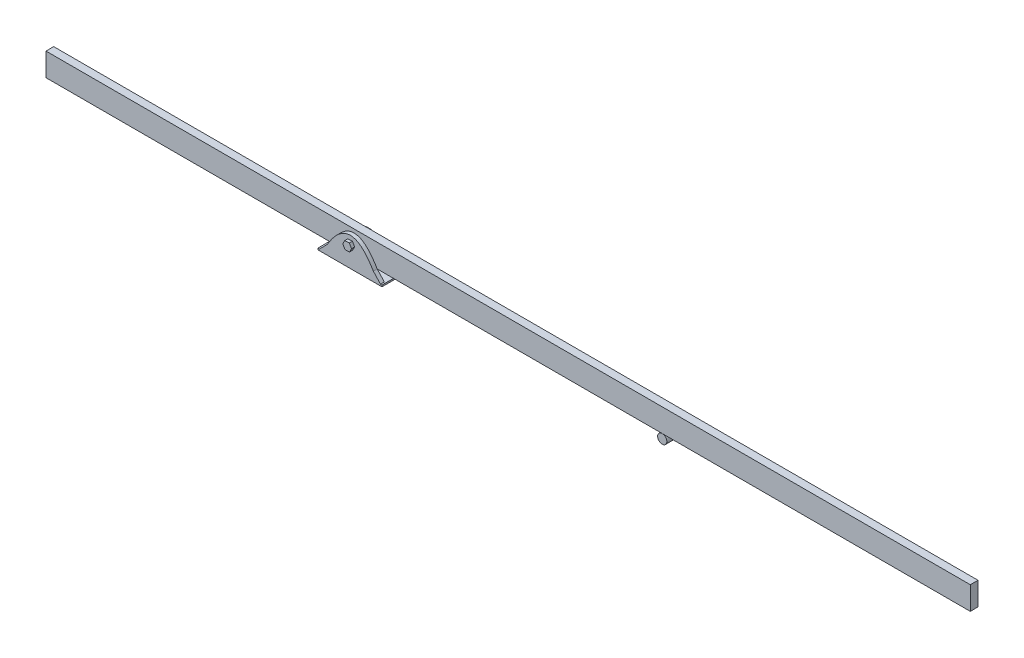
ISO-10303-21;
HEADER;
FILE_DESCRIPTION(('STEP AP214'),'2;1');
FILE_NAME('part.step','',(''),(''),'','','');
FILE_SCHEMA(('AUTOMOTIVE_DESIGN { 1 0 10303 214 1 1 1 1 }'));
ENDSEC;
DATA;
#1=APPLICATION_CONTEXT('core data for automotive mechanical design processes');
#2=APPLICATION_PROTOCOL_DEFINITION('international standard','automotive_design',2000,#1);
#3=PRODUCT_CONTEXT('',#1,'mechanical');
#4=PRODUCT('Part','Part','',(#3));
#5=PRODUCT_RELATED_PRODUCT_CATEGORY('part','',(#4));
#6=PRODUCT_DEFINITION_FORMATION('','',#4);
#7=PRODUCT_DEFINITION_CONTEXT('part definition',#1,'design');
#8=PRODUCT_DEFINITION('design','',#6,#7);
#9=PRODUCT_DEFINITION_SHAPE('','',#8);
#10=(LENGTH_UNIT() NAMED_UNIT(*) SI_UNIT(.MILLI.,.METRE.));
#11=(NAMED_UNIT(*) PLANE_ANGLE_UNIT() SI_UNIT($,.RADIAN.));
#12=(NAMED_UNIT(*) SI_UNIT($,.STERADIAN.) SOLID_ANGLE_UNIT());
#13=UNCERTAINTY_MEASURE_WITH_UNIT(LENGTH_MEASURE(1.E-05),#10,'distance_accuracy_value','');
#14=(GEOMETRIC_REPRESENTATION_CONTEXT(3) GLOBAL_UNCERTAINTY_ASSIGNED_CONTEXT((#13)) GLOBAL_UNIT_ASSIGNED_CONTEXT((#10,
#11,#12)) REPRESENTATION_CONTEXT('',''));
#15=CARTESIAN_POINT('',(0.,0.,0.));
#16=DIRECTION('',(0.,0.,1.));
#17=DIRECTION('',(1.,0.,0.));
#18=AXIS2_PLACEMENT_3D('',#15,#16,#17);
#19=CARTESIAN_POINT('',(0.,0.,-45.));
#20=DIRECTION('',(0.,0.,-1.));
#21=DIRECTION('',(-1.,0.,0.));
#22=AXIS2_PLACEMENT_3D('',#19,#20,#21);
#23=PLANE('',#22);
#24=DIRECTION('',(0.500000000000004,0.866025403784436,0.));
#25=VECTOR('',#24,1.);
#26=CARTESIAN_POINT('',(-1037.76365609631,-0.00780640067777938,-45.));
#27=LINE('',#26,#25);
#28=CARTESIAN_POINT('',(-1037.76365609631,-0.00780640067777938,-45.));
#29=VERTEX_POINT('',#28);
#30=CARTESIAN_POINT('',(-1018.88192562817,32.6963101049764,-45.));
#31=VERTEX_POINT('',#30);
#32=EDGE_CURVE('E147',#29,#31,#27,.T.);
#33=ORIENTED_EDGE('',*,*,#32,.T.);
#34=DIRECTION('',(1.,0.,0.));
#35=VECTOR('',#34,1.);
#36=CARTESIAN_POINT('',(-1018.88192562817,32.6963101049764,-45.));
#37=LINE('',#36,#35);
#38=CARTESIAN_POINT('',(-981.118464691869,32.6963101049764,-45.));
#39=VERTEX_POINT('',#38);
#40=EDGE_CURVE('E105',#31,#39,#37,.T.);
#41=ORIENTED_EDGE('',*,*,#40,.T.);
#42=DIRECTION('',(0.5,-0.866025403784439,0.));
#43=VECTOR('',#42,1.);
#44=CARTESIAN_POINT('',(-981.118464691869,32.6963101049764,-45.));
#45=LINE('',#44,#43);
#46=CARTESIAN_POINT('',(-962.23673422372,-0.00780640067776783,-45.));
#47=VERTEX_POINT('',#46);
#48=EDGE_CURVE('E118',#39,#47,#45,.T.);
#49=ORIENTED_EDGE('',*,*,#48,.T.);
#50=DIRECTION('',(-0.500000000000001,-0.866025403784438,0.));
#51=VECTOR('',#50,1.);
#52=CARTESIAN_POINT('',(-962.23673422372,-0.00780640067776783,-45.));
#53=LINE('',#52,#51);
#54=CARTESIAN_POINT('',(-981.118464691869,-32.7119229063321,-45.));
#55=VERTEX_POINT('',#54);
#56=EDGE_CURVE('E112',#47,#55,#53,.T.);
#57=ORIENTED_EDGE('',*,*,#56,.T.);
#58=DIRECTION('',(-1.,0.,0.));
#59=VECTOR('',#58,1.);
#60=CARTESIAN_POINT('',(-981.118464691869,-32.7119229063321,-45.));
#61=LINE('',#60,#59);
#62=CARTESIAN_POINT('',(-1018.88192562817,-32.7119229063321,-45.));
#63=VERTEX_POINT('',#62);
#64=EDGE_CURVE('E116',#55,#63,#61,.T.);
#65=ORIENTED_EDGE('',*,*,#64,.T.);
#66=DIRECTION('',(-0.500000000000003,0.866025403784437,0.));
#67=VECTOR('',#66,1.);
#68=CARTESIAN_POINT('',(-1018.88192562817,-32.7119229063321,-45.));
#69=LINE('',#68,#67);
#70=EDGE_CURVE('E68',#63,#29,#69,.T.);
#71=ORIENTED_EDGE('',*,*,#70,.T.);
#72=EDGE_LOOP('',(#33,#41,#49,#57,#65,#71));
#73=FACE_BOUND('',#72,.T.);
#74=CARTESIAN_POINT('',(-1000.00019516002,-0.00780640067777939,-45.));
#75=DIRECTION('',(0.,0.,-1.));
#76=DIRECTION('',(-1.,0.,0.));
#77=AXIS2_PLACEMENT_3D('',#74,#75,#76);
#78=CIRCLE('',#77,24.9999999999998);
#79=CARTESIAN_POINT('',(-1025.00019516002,-0.00780640067777939,-45.));
#80=VERTEX_POINT('',#79);
#81=EDGE_CURVE('E140',#80,#80,#78,.T.);
#82=ORIENTED_EDGE('',*,*,#81,.F.);
#83=EDGE_LOOP('',(#82));
#84=FACE_BOUND('',#83,.T.);
#85=ADVANCED_FACE('F51',(#73,#84),#23,.T.);
#86=CARTESIAN_POINT('',(0.,0.,-25.));
#87=DIRECTION('',(0.,0.,-1.));
#88=DIRECTION('',(-1.,0.,0.));
#89=AXIS2_PLACEMENT_3D('',#86,#87,#88);
#90=PLANE('',#89);
#91=DIRECTION('',(0.500000000000004,0.866025403784436,0.));
#92=VECTOR('',#91,1.);
#93=CARTESIAN_POINT('',(-1037.76365609631,-0.00780640067777938,-25.));
#94=LINE('',#93,#92);
#95=CARTESIAN_POINT('',(-1037.76365609631,-0.00780640067777938,-25.));
#96=VERTEX_POINT('',#95);
#97=CARTESIAN_POINT('',(-1018.88192562817,32.6963101049764,-25.));
#98=VERTEX_POINT('',#97);
#99=EDGE_CURVE('E136',#96,#98,#94,.T.);
#100=ORIENTED_EDGE('',*,*,#99,.F.);
#101=DIRECTION('',(-0.500000000000003,0.866025403784437,0.));
#102=VECTOR('',#101,1.);
#103=CARTESIAN_POINT('',(-1018.88192562817,-32.7119229063321,-25.));
#104=LINE('',#103,#102);
#105=CARTESIAN_POINT('',(-1018.88192562817,-32.7119229063321,-25.));
#106=VERTEX_POINT('',#105);
#107=EDGE_CURVE('E97',#106,#96,#104,.T.);
#108=ORIENTED_EDGE('',*,*,#107,.F.);
#109=DIRECTION('',(-1.,0.,0.));
#110=VECTOR('',#109,1.);
#111=CARTESIAN_POINT('',(-981.118464691869,-32.7119229063321,-25.));
#112=LINE('',#111,#110);
#113=CARTESIAN_POINT('',(-981.118464691869,-32.7119229063321,-25.));
#114=VERTEX_POINT('',#113);
#115=EDGE_CURVE('E91',#114,#106,#112,.T.);
#116=ORIENTED_EDGE('',*,*,#115,.F.);
#117=DIRECTION('',(-0.500000000000001,-0.866025403784438,0.));
#118=VECTOR('',#117,1.);
#119=CARTESIAN_POINT('',(-962.23673422372,-0.00780640067776783,-25.));
#120=LINE('',#119,#118);
#121=CARTESIAN_POINT('',(-962.23673422372,-0.00780640067776783,-25.));
#122=VERTEX_POINT('',#121);
#123=EDGE_CURVE('E126',#122,#114,#120,.T.);
#124=ORIENTED_EDGE('',*,*,#123,.F.);
#125=DIRECTION('',(0.5,-0.866025403784439,0.));
#126=VECTOR('',#125,1.);
#127=CARTESIAN_POINT('',(-981.118464691869,32.6963101049764,-25.));
#128=LINE('',#127,#126);
#129=CARTESIAN_POINT('',(-981.118464691869,32.6963101049764,-25.));
#130=VERTEX_POINT('',#129);
#131=EDGE_CURVE('E142',#130,#122,#128,.T.);
#132=ORIENTED_EDGE('',*,*,#131,.F.);
#133=DIRECTION('',(1.,0.,0.));
#134=VECTOR('',#133,1.);
#135=CARTESIAN_POINT('',(-1018.88192562817,32.6963101049764,-25.));
#136=LINE('',#135,#134);
#137=EDGE_CURVE('E139',#98,#130,#136,.T.);
#138=ORIENTED_EDGE('',*,*,#137,.F.);
#139=EDGE_LOOP('',(#100,#108,#116,#124,#132,#138));
#140=FACE_BOUND('',#139,.T.);
#141=CARTESIAN_POINT('',(-1000.00019516002,-0.00780640067777939,-25.));
#142=DIRECTION('',(0.,0.,-1.));
#143=DIRECTION('',(-1.,0.,0.));
#144=AXIS2_PLACEMENT_3D('',#141,#142,#143);
#145=CIRCLE('',#144,24.9999999999998);
#146=CARTESIAN_POINT('',(-1025.00019516002,-0.00780640067777939,-25.));
#147=VERTEX_POINT('',#146);
#148=EDGE_CURVE('E242',#147,#147,#145,.T.);
#149=ORIENTED_EDGE('',*,*,#148,.T.);
#150=EDGE_LOOP('',(#149));
#151=FACE_BOUND('',#150,.T.);
#152=ADVANCED_FACE('F156',(#140,#151),#90,.F.);
#153=CARTESIAN_POINT('',(-1037.76365609631,-0.00780640067777938,-45.));
#154=DIRECTION('',(0.866025403784436,-0.500000000000004,0.));
#155=DIRECTION('',(0.500000000000005,0.866025403784436,0.));
#156=AXIS2_PLACEMENT_3D('',#153,#154,#155);
#157=PLANE('',#156);
#158=ORIENTED_EDGE('',*,*,#99,.T.);
#159=DIRECTION('',(0.,0.,1.));
#160=VECTOR('',#159,1.);
#161=CARTESIAN_POINT('',(-1018.88192562817,32.6963101049764,-45.));
#162=LINE('',#161,#160);
#163=EDGE_CURVE('E12',#31,#98,#162,.T.);
#164=ORIENTED_EDGE('',*,*,#163,.F.);
#165=ORIENTED_EDGE('',*,*,#32,.F.);
#166=DIRECTION('',(0.,0.,1.));
#167=VECTOR('',#166,1.);
#168=CARTESIAN_POINT('',(-1037.76365609631,-0.00780640067777938,-45.));
#169=LINE('',#168,#167);
#170=EDGE_CURVE('E132',#29,#96,#169,.T.);
#171=ORIENTED_EDGE('',*,*,#170,.T.);
#172=EDGE_LOOP('',(#158,#164,#165,#171));
#173=FACE_BOUND('',#172,.T.);
#174=ADVANCED_FACE('F53',(#173),#157,.F.);
#175=CARTESIAN_POINT('',(-1018.88192562817,32.6963101049764,-45.));
#176=DIRECTION('',(0.,-1.,0.));
#177=DIRECTION('',(1.,0.,0.));
#178=AXIS2_PLACEMENT_3D('',#175,#176,#177);
#179=PLANE('',#178);
#180=ORIENTED_EDGE('',*,*,#137,.T.);
#181=DIRECTION('',(0.,0.,1.));
#182=VECTOR('',#181,1.);
#183=CARTESIAN_POINT('',(-981.118464691869,32.6963101049764,-45.));
#184=LINE('',#183,#182);
#185=EDGE_CURVE('E60',#39,#130,#184,.T.);
#186=ORIENTED_EDGE('',*,*,#185,.F.);
#187=ORIENTED_EDGE('',*,*,#40,.F.);
#188=ORIENTED_EDGE('',*,*,#163,.T.);
#189=EDGE_LOOP('',(#180,#186,#187,#188));
#190=FACE_BOUND('',#189,.T.);
#191=ADVANCED_FACE('F181',(#190),#179,.F.);
#192=CARTESIAN_POINT('',(-981.118464691869,32.6963101049764,-45.));
#193=DIRECTION('',(-0.866025403784439,-0.5,0.));
#194=DIRECTION('',(0.5,-0.866025403784439,0.));
#195=AXIS2_PLACEMENT_3D('',#192,#193,#194);
#196=PLANE('',#195);
#197=ORIENTED_EDGE('',*,*,#131,.T.);
#198=DIRECTION('',(0.,0.,1.));
#199=VECTOR('',#198,1.);
#200=CARTESIAN_POINT('',(-962.23673422372,-0.00780640067776783,-45.));
#201=LINE('',#200,#199);
#202=EDGE_CURVE('E127',#47,#122,#201,.T.);
#203=ORIENTED_EDGE('',*,*,#202,.F.);
#204=ORIENTED_EDGE('',*,*,#48,.F.);
#205=ORIENTED_EDGE('',*,*,#185,.T.);
#206=EDGE_LOOP('',(#197,#203,#204,#205));
#207=FACE_BOUND('',#206,.T.);
#208=ADVANCED_FACE('F153',(#207),#196,.F.);
#209=CARTESIAN_POINT('',(-962.23673422372,-0.00780640067776783,-45.));
#210=DIRECTION('',(-0.866025403784438,0.500000000000001,0.));
#211=DIRECTION('',(-0.500000000000001,-0.866025403784438,0.));
#212=AXIS2_PLACEMENT_3D('',#209,#210,#211);
#213=PLANE('',#212);
#214=ORIENTED_EDGE('',*,*,#123,.T.);
#215=DIRECTION('',(0.,0.,1.));
#216=VECTOR('',#215,1.);
#217=CARTESIAN_POINT('',(-981.118464691869,-32.7119229063321,-45.));
#218=LINE('',#217,#216);
#219=EDGE_CURVE('E123',#55,#114,#218,.T.);
#220=ORIENTED_EDGE('',*,*,#219,.F.);
#221=ORIENTED_EDGE('',*,*,#56,.F.);
#222=ORIENTED_EDGE('',*,*,#202,.T.);
#223=EDGE_LOOP('',(#214,#220,#221,#222));
#224=FACE_BOUND('',#223,.T.);
#225=ADVANCED_FACE('F124',(#224),#213,.F.);
#226=CARTESIAN_POINT('',(-981.118464691869,-32.7119229063321,-45.));
#227=DIRECTION('',(0.,1.,0.));
#228=DIRECTION('',(-1.,0.,0.));
#229=AXIS2_PLACEMENT_3D('',#226,#227,#228);
#230=PLANE('',#229);
#231=ORIENTED_EDGE('',*,*,#115,.T.);
#232=DIRECTION('',(0.,0.,1.));
#233=VECTOR('',#232,1.);
#234=CARTESIAN_POINT('',(-1018.88192562817,-32.7119229063321,-45.));
#235=LINE('',#234,#233);
#236=EDGE_CURVE('E128',#63,#106,#235,.T.);
#237=ORIENTED_EDGE('',*,*,#236,.F.);
#238=ORIENTED_EDGE('',*,*,#64,.F.);
#239=ORIENTED_EDGE('',*,*,#219,.T.);
#240=EDGE_LOOP('',(#231,#237,#238,#239));
#241=FACE_BOUND('',#240,.T.);
#242=ADVANCED_FACE('F130',(#241),#230,.F.);
#243=CARTESIAN_POINT('',(-1018.88192562817,-32.7119229063321,-45.));
#244=DIRECTION('',(0.866025403784437,0.500000000000003,0.));
#245=DIRECTION('',(-0.500000000000003,0.866025403784437,0.));
#246=AXIS2_PLACEMENT_3D('',#243,#244,#245);
#247=PLANE('',#246);
#248=ORIENTED_EDGE('',*,*,#107,.T.);
#249=ORIENTED_EDGE('',*,*,#170,.F.);
#250=ORIENTED_EDGE('',*,*,#70,.F.);
#251=ORIENTED_EDGE('',*,*,#236,.T.);
#252=EDGE_LOOP('',(#248,#249,#250,#251));
#253=FACE_BOUND('',#252,.T.);
#254=ADVANCED_FACE('F161',(#253),#247,.F.);
#255=CARTESIAN_POINT('',(-1000.00019516002,-0.00780640067777939,-45.));
#256=DIRECTION('',(0.,0.,1.));
#257=DIRECTION('',(1.,0.,0.));
#258=AXIS2_PLACEMENT_3D('',#255,#256,#257);
#259=CYLINDRICAL_SURFACE('',#258,24.9999999999998);
#260=ORIENTED_EDGE('',*,*,#81,.T.);
#261=EDGE_LOOP('',(#260));
#262=FACE_BOUND('',#261,.T.);
#263=ORIENTED_EDGE('',*,*,#148,.F.);
#264=EDGE_LOOP('',(#263));
#265=FACE_BOUND('',#264,.T.);
#266=ADVANCED_FACE('F163',(#262,#265),#259,.F.);
#267=CLOSED_SHELL('',(#85,#152,#174,#191,#208,#225,#242,#254,#266));
#268=MANIFOLD_SOLID_BREP('B2',#267);
#269=CARTESIAN_POINT('',(1000.,-105.,50.));
#270=DIRECTION('',(0.,0.,-1.));
#271=DIRECTION('',(-1.,0.,0.));
#272=AXIS2_PLACEMENT_3D('',#269,#270,#271);
#273=CYLINDRICAL_SURFACE('',#272,30.);
#274=CARTESIAN_POINT('',(1000.,-105.,50.));
#275=DIRECTION('',(0.,0.,1.));
#276=DIRECTION('',(1.,0.,0.));
#277=AXIS2_PLACEMENT_3D('',#274,#275,#276);
#278=CIRCLE('',#277,30.);
#279=CARTESIAN_POINT('',(1030.,-105.,50.));
#280=VERTEX_POINT('',#279);
#281=EDGE_CURVE('E50',#280,#280,#278,.T.);
#282=ORIENTED_EDGE('',*,*,#281,.F.);
#283=EDGE_LOOP('',(#282));
#284=FACE_BOUND('',#283,.T.);
#285=CARTESIAN_POINT('',(1000.,-105.,0.));
#286=DIRECTION('',(0.,0.,1.));
#287=DIRECTION('',(1.,0.,0.));
#288=AXIS2_PLACEMENT_3D('',#285,#286,#287);
#289=CIRCLE('',#288,30.);
#290=CARTESIAN_POINT('',(1030.,-105.,0.));
#291=VERTEX_POINT('',#290);
#292=EDGE_CURVE('E261',#291,#291,#289,.T.);
#293=ORIENTED_EDGE('',*,*,#292,.T.);
#294=EDGE_LOOP('',(#293));
#295=FACE_BOUND('',#294,.T.);
#296=ADVANCED_FACE('F258',(#284,#295),#273,.T.);
#297=CARTESIAN_POINT('',(0.,0.,50.));
#298=DIRECTION('',(0.,0.,1.));
#299=DIRECTION('',(1.,0.,0.));
#300=AXIS2_PLACEMENT_3D('',#297,#298,#299);
#301=PLANE('',#300);
#302=ORIENTED_EDGE('',*,*,#281,.T.);
#303=EDGE_LOOP('',(#302));
#304=FACE_BOUND('',#303,.T.);
#305=ADVANCED_FACE('F273',(#304),#301,.T.);
#306=CARTESIAN_POINT('',(0.,0.,0.));
#307=DIRECTION('',(0.,0.,1.));
#308=DIRECTION('',(1.,0.,0.));
#309=AXIS2_PLACEMENT_3D('',#306,#307,#308);
#310=PLANE('',#309);
#311=ORIENTED_EDGE('',*,*,#292,.F.);
#312=EDGE_LOOP('',(#311));
#313=FACE_BOUND('',#312,.T.);
#314=ADVANCED_FACE('F271',(#313),#310,.F.);
#315=CLOSED_SHELL('',(#296,#305,#314));
#316=MANIFOLD_SOLID_BREP('B6',#315);
#317=CARTESIAN_POINT('',(0.,0.,75.));
#318=DIRECTION('',(0.,0.,1.));
#319=DIRECTION('',(1.,0.,0.));
#320=AXIS2_PLACEMENT_3D('',#317,#318,#319);
#321=PLANE('',#320);
#322=DIRECTION('',(-0.707106781186541,-0.707106781186554,0.));
#323=VECTOR('',#322,1.);
#324=CARTESIAN_POINT('',(-537.500097580019,537.500097580009,75.));
#325=LINE('',#324,#323);
#326=CARTESIAN_POINT('',(-1150.00019516002,-75.,75.));
#327=VERTEX_POINT('',#326);
#328=CARTESIAN_POINT('',(-1200.00019516002,-125.,75.));
#329=VERTEX_POINT('',#328);
#330=EDGE_CURVE('E553',#327,#329,#325,.T.);
#331=ORIENTED_EDGE('',*,*,#330,.T.);
#332=DIRECTION('',(1.,0.,0.));
#333=VECTOR('',#332,1.);
#334=CARTESIAN_POINT('',(-1210.00019516002,-125.,75.));
#335=LINE('',#334,#333);
#336=CARTESIAN_POINT('',(-1210.00019516002,-125.,75.));
#337=VERTEX_POINT('',#336);
#338=EDGE_CURVE('E676',#337,#329,#335,.T.);
#339=ORIENTED_EDGE('',*,*,#338,.F.);
#340=DIRECTION('',(0.,1.,0.));
#341=VECTOR('',#340,1.);
#342=CARTESIAN_POINT('',(-1210.00019516002,-135.,75.));
#343=LINE('',#342,#341);
#344=CARTESIAN_POINT('',(-1210.00019516002,-135.,75.));
#345=VERTEX_POINT('',#344);
#346=EDGE_CURVE('E672',#345,#337,#343,.T.);
#347=ORIENTED_EDGE('',*,*,#346,.F.);
#348=DIRECTION('',(-1.,0.,0.));
#349=VECTOR('',#348,1.);
#350=CARTESIAN_POINT('',(0.,-135.,75.));
#351=LINE('',#350,#349);
#352=CARTESIAN_POINT('',(-794.109241723402,-135.,75.));
#353=VERTEX_POINT('',#352);
#354=EDGE_CURVE('E577',#353,#345,#351,.T.);
#355=ORIENTED_EDGE('',*,*,#354,.F.);
#356=DIRECTION('',(0.,-1.,0.));
#357=VECTOR('',#356,1.);
#358=CARTESIAN_POINT('',(-794.109241723402,-125.,75.));
#359=LINE('',#358,#357);
#360=CARTESIAN_POINT('',(-794.109241723402,-125.,75.));
#361=VERTEX_POINT('',#360);
#362=EDGE_CURVE('E670',#361,#353,#359,.T.);
#363=ORIENTED_EDGE('',*,*,#362,.F.);
#364=CARTESIAN_POINT('',(-803.424400629505,-125.,75.));
#365=VERTEX_POINT('',#364);
#366=EDGE_CURVE('E675',#365,#361,#335,.T.);
#367=ORIENTED_EDGE('',*,*,#366,.F.);
#368=DIRECTION('',(0.681607197239936,-0.731718271379579,0.));
#369=VECTOR('',#368,1.);
#370=CARTESIAN_POINT('',(-492.505821870375,-458.776999290312,75.));
#371=LINE('',#370,#369);
#372=CARTESIAN_POINT('',(-850.000195160017,-75.,75.));
#373=VERTEX_POINT('',#372);
#374=EDGE_CURVE('E554',#373,#365,#371,.T.);
#375=ORIENTED_EDGE('',*,*,#374,.F.);
#376=CARTESIAN_POINT('',(-1150.00019516002,-75.,75.));
#377=CARTESIAN_POINT('',(-1000.00019516002,179.221874073462,75.));
#378=CARTESIAN_POINT('',(-850.000195160017,-75.,75.));
#379=B_SPLINE_CURVE_WITH_KNOTS('',2,(#376,#377,#378),.UNSPECIFIED.,.F.,.F.,(3,3),(0.,1.),.UNSPECIFIED.);
#380=EDGE_CURVE('E546',#327,#373,#379,.T.);
#381=ORIENTED_EDGE('',*,*,#380,.F.);
#382=EDGE_LOOP('',(#331,#339,#347,#355,#363,#367,#375,#381));
#383=FACE_BOUND('',#382,.T.);
#384=DIRECTION('',(-0.999180024829476,-0.0404879979965341,0.));
#385=VECTOR('',#384,1.);
#386=CARTESIAN_POINT('',(-986.569847375723,25.5954095497647,75.));
#387=LINE('',#386,#385);
#388=CARTESIAN_POINT('',(-986.569847375723,25.5954095497647,75.));
#389=VERTEX_POINT('',#388);
#390=CARTESIAN_POINT('',(-1015.45805669953,24.4248239374017,75.));
#391=VERTEX_POINT('',#390);
#392=EDGE_CURVE('E740',#389,#391,#387,.T.);
#393=ORIENTED_EDGE('',*,*,#392,.F.);
#394=DIRECTION('',(-0.534653647228111,0.845071285458025,0.));
#395=VECTOR('',#394,1.);
#396=CARTESIAN_POINT('',(-971.111985836208,1.16277921168522,75.));
#397=LINE('',#396,#395);
#398=CARTESIAN_POINT('',(-971.111985836208,1.16277921168522,75.));
#399=VERTEX_POINT('',#398);
#400=EDGE_CURVE('E473',#399,#389,#397,.T.);
#401=ORIENTED_EDGE('',*,*,#400,.F.);
#402=DIRECTION('',(0.464526377601366,0.88555928345456,0.));
#403=VECTOR('',#402,1.);
#404=CARTESIAN_POINT('',(-984.542333620502,-24.4404367387573,75.));
#405=LINE('',#404,#403);
#406=CARTESIAN_POINT('',(-984.542333620502,-24.4404367387574,75.));
#407=VERTEX_POINT('',#406);
#408=EDGE_CURVE('E469',#407,#399,#405,.T.);
#409=ORIENTED_EDGE('',*,*,#408,.F.);
#410=DIRECTION('',(0.999180024829476,0.0404879979965357,0.));
#411=VECTOR('',#410,1.);
#412=CARTESIAN_POINT('',(-1013.43054294431,-25.6110223511203,75.));
#413=LINE('',#412,#411);
#414=CARTESIAN_POINT('',(-1013.43054294431,-25.6110223511203,75.));
#415=VERTEX_POINT('',#414);
#416=EDGE_CURVE('E755',#415,#407,#413,.T.);
#417=ORIENTED_EDGE('',*,*,#416,.F.);
#418=DIRECTION('',(0.534653647228109,-0.845071285458026,0.));
#419=VECTOR('',#418,1.);
#420=CARTESIAN_POINT('',(-1028.88840448383,-1.17839201304073,75.));
#421=LINE('',#420,#419);
#422=CARTESIAN_POINT('',(-1028.88840448383,-1.17839201304073,75.));
#423=VERTEX_POINT('',#422);
#424=EDGE_CURVE('E753',#423,#415,#421,.T.);
#425=ORIENTED_EDGE('',*,*,#424,.F.);
#426=DIRECTION('',(-0.464526377601368,-0.885559283454559,0.));
#427=VECTOR('',#426,1.);
#428=CARTESIAN_POINT('',(-1015.45805669953,24.4248239374017,75.));
#429=LINE('',#428,#427);
#430=EDGE_CURVE('E751',#391,#423,#429,.T.);
#431=ORIENTED_EDGE('',*,*,#430,.F.);
#432=EDGE_LOOP('',(#393,#401,#409,#417,#425,#431));
#433=FACE_BOUND('',#432,.T.);
#434=ADVANCED_FACE('F301',(#383,#433),#321,.T.);
#435=CARTESIAN_POINT('',(0.,0.,50.));
#436=DIRECTION('',(0.,0.,1.));
#437=DIRECTION('',(1.,0.,0.));
#438=AXIS2_PLACEMENT_3D('',#435,#436,#437);
#439=PLANE('',#438);
#440=DIRECTION('',(1.,0.,0.));
#441=VECTOR('',#440,1.);
#442=CARTESIAN_POINT('',(0.,-75.,50.));
#443=LINE('',#442,#441);
#444=CARTESIAN_POINT('',(-3000.,-75.,50.));
#445=VERTEX_POINT('',#444);
#446=CARTESIAN_POINT('',(-1150.00019516002,-75.,50.));
#447=VERTEX_POINT('',#446);
#448=EDGE_CURVE('E587',#445,#447,#443,.T.);
#449=ORIENTED_EDGE('',*,*,#448,.T.);
#450=CARTESIAN_POINT('',(-1150.00019516002,-75.,50.));
#451=CARTESIAN_POINT('',(-1000.00019516002,179.221874073462,50.));
#452=CARTESIAN_POINT('',(-850.000195160017,-75.,50.));
#453=B_SPLINE_CURVE_WITH_KNOTS('',2,(#450,#451,#452),.UNSPECIFIED.,.F.,.F.,(3,3),(0.,1.),.UNSPECIFIED.);
#454=CARTESIAN_POINT('',(-850.000195160017,-74.9999999999999,50.));
#455=VERTEX_POINT('',#454);
#456=EDGE_CURVE('E565',#447,#455,#453,.T.);
#457=ORIENTED_EDGE('',*,*,#456,.T.);
#458=CARTESIAN_POINT('',(3000.,-75.,50.));
#459=VERTEX_POINT('',#458);
#460=EDGE_CURVE('E592',#455,#459,#443,.T.);
#461=ORIENTED_EDGE('',*,*,#460,.T.);
#462=DIRECTION('',(0.,1.,0.));
#463=VECTOR('',#462,1.);
#464=CARTESIAN_POINT('',(3000.,0.,50.));
#465=LINE('',#464,#463);
#466=CARTESIAN_POINT('',(3000.,75.,50.));
#467=VERTEX_POINT('',#466);
#468=EDGE_CURVE('E590',#459,#467,#465,.T.);
#469=ORIENTED_EDGE('',*,*,#468,.T.);
#470=DIRECTION('',(1.,0.,0.));
#471=VECTOR('',#470,1.);
#472=CARTESIAN_POINT('',(0.,75.,50.));
#473=LINE('',#472,#471);
#474=CARTESIAN_POINT('',(-3000.,75.,50.));
#475=VERTEX_POINT('',#474);
#476=EDGE_CURVE('E594',#475,#467,#473,.T.);
#477=ORIENTED_EDGE('',*,*,#476,.F.);
#478=DIRECTION('',(0.,1.,0.));
#479=VECTOR('',#478,1.);
#480=CARTESIAN_POINT('',(-3000.,0.,50.));
#481=LINE('',#480,#479);
#482=EDGE_CURVE('E597',#445,#475,#481,.T.);
#483=ORIENTED_EDGE('',*,*,#482,.F.);
#484=EDGE_LOOP('',(#449,#457,#461,#469,#477,#483));
#485=FACE_BOUND('',#484,.T.);
#486=ADVANCED_FACE('F528',(#485),#439,.T.);
#487=CARTESIAN_POINT('',(0.,-75.,50.));
#488=DIRECTION('',(0.,1.,0.));
#489=DIRECTION('',(0.,0.,1.));
#490=AXIS2_PLACEMENT_3D('',#487,#488,#489);
#491=PLANE('',#490);
#492=DIRECTION('',(1.,0.,0.));
#493=VECTOR('',#492,1.);
#494=CARTESIAN_POINT('',(0.,-75.,0.));
#495=LINE('',#494,#493);
#496=CARTESIAN_POINT('',(-3000.,-75.,0.));
#497=VERTEX_POINT('',#496);
#498=CARTESIAN_POINT('',(-1150.00019516002,-75.,0.));
#499=VERTEX_POINT('',#498);
#500=EDGE_CURVE('E601',#497,#499,#495,.T.);
#501=ORIENTED_EDGE('',*,*,#500,.T.);
#502=CARTESIAN_POINT('',(-850.000195160017,-75.,0.));
#503=VERTEX_POINT('',#502);
#504=EDGE_CURVE('E605',#499,#503,#495,.T.);
#505=ORIENTED_EDGE('',*,*,#504,.T.);
#506=CARTESIAN_POINT('',(3000.,-75.,0.));
#507=VERTEX_POINT('',#506);
#508=EDGE_CURVE('E586',#503,#507,#495,.T.);
#509=ORIENTED_EDGE('',*,*,#508,.T.);
#510=DIRECTION('',(0.,0.,-1.));
#511=VECTOR('',#510,1.);
#512=CARTESIAN_POINT('',(3000.,-75.,50.));
#513=LINE('',#512,#511);
#514=EDGE_CURVE('E256',#459,#507,#513,.T.);
#515=ORIENTED_EDGE('',*,*,#514,.F.);
#516=ORIENTED_EDGE('',*,*,#460,.F.);
#517=EDGE_CURVE('E591',#447,#455,#443,.T.);
#518=ORIENTED_EDGE('',*,*,#517,.F.);
#519=ORIENTED_EDGE('',*,*,#448,.F.);
#520=DIRECTION('',(0.,0.,-1.));
#521=VECTOR('',#520,1.);
#522=CARTESIAN_POINT('',(-3000.,-75.,50.));
#523=LINE('',#522,#521);
#524=EDGE_CURVE('E600',#445,#497,#523,.T.);
#525=ORIENTED_EDGE('',*,*,#524,.T.);
#526=EDGE_LOOP('',(#501,#505,#509,#515,#516,#518,#519,#525));
#527=FACE_BOUND('',#526,.T.);
#528=ADVANCED_FACE('F303',(#527),#491,.F.);
#529=CARTESIAN_POINT('',(3000.,0.,50.));
#530=DIRECTION('',(-1.,0.,0.));
#531=DIRECTION('',(0.,0.,1.));
#532=AXIS2_PLACEMENT_3D('',#529,#530,#531);
#533=PLANE('',#532);
#534=DIRECTION('',(0.,1.,0.));
#535=VECTOR('',#534,1.);
#536=CARTESIAN_POINT('',(3000.,0.,0.));
#537=LINE('',#536,#535);
#538=CARTESIAN_POINT('',(3000.,75.,0.));
#539=VERTEX_POINT('',#538);
#540=EDGE_CURVE('E604',#507,#539,#537,.T.);
#541=ORIENTED_EDGE('',*,*,#540,.T.);
#542=DIRECTION('',(0.,0.,-1.));
#543=VECTOR('',#542,1.);
#544=CARTESIAN_POINT('',(3000.,75.,50.));
#545=LINE('',#544,#543);
#546=EDGE_CURVE('E309',#467,#539,#545,.T.);
#547=ORIENTED_EDGE('',*,*,#546,.F.);
#548=ORIENTED_EDGE('',*,*,#468,.F.);
#549=ORIENTED_EDGE('',*,*,#514,.T.);
#550=EDGE_LOOP('',(#541,#547,#548,#549));
#551=FACE_BOUND('',#550,.T.);
#552=ADVANCED_FACE('F624',(#551),#533,.F.);
#553=CARTESIAN_POINT('',(0.,75.,50.));
#554=DIRECTION('',(0.,1.,0.));
#555=DIRECTION('',(0.,0.,1.));
#556=AXIS2_PLACEMENT_3D('',#553,#554,#555);
#557=PLANE('',#556);
#558=DIRECTION('',(1.,0.,0.));
#559=VECTOR('',#558,1.);
#560=CARTESIAN_POINT('',(0.,75.,0.));
#561=LINE('',#560,#559);
#562=CARTESIAN_POINT('',(-3000.,75.,0.));
#563=VERTEX_POINT('',#562);
#564=EDGE_CURVE('E608',#563,#539,#561,.T.);
#565=ORIENTED_EDGE('',*,*,#564,.F.);
#566=DIRECTION('',(0.,0.,-1.));
#567=VECTOR('',#566,1.);
#568=CARTESIAN_POINT('',(-3000.,75.,50.));
#569=LINE('',#568,#567);
#570=EDGE_CURVE('E615',#475,#563,#569,.T.);
#571=ORIENTED_EDGE('',*,*,#570,.F.);
#572=ORIENTED_EDGE('',*,*,#476,.T.);
#573=ORIENTED_EDGE('',*,*,#546,.T.);
#574=EDGE_LOOP('',(#565,#571,#572,#573));
#575=FACE_BOUND('',#574,.T.);
#576=ADVANCED_FACE('F619',(#575),#557,.T.);
#577=CARTESIAN_POINT('',(-3000.,0.,50.));
#578=DIRECTION('',(-1.,0.,0.));
#579=DIRECTION('',(0.,0.,1.));
#580=AXIS2_PLACEMENT_3D('',#577,#578,#579);
#581=PLANE('',#580);
#582=DIRECTION('',(0.,1.,0.));
#583=VECTOR('',#582,1.);
#584=CARTESIAN_POINT('',(-3000.,0.,0.));
#585=LINE('',#584,#583);
#586=EDGE_CURVE('E611',#497,#563,#585,.T.);
#587=ORIENTED_EDGE('',*,*,#586,.F.);
#588=ORIENTED_EDGE('',*,*,#524,.F.);
#589=ORIENTED_EDGE('',*,*,#482,.T.);
#590=ORIENTED_EDGE('',*,*,#570,.T.);
#591=EDGE_LOOP('',(#587,#588,#589,#590));
#592=FACE_BOUND('',#591,.T.);
#593=ADVANCED_FACE('F631',(#592),#581,.T.);
#594=CARTESIAN_POINT('',(0.,0.,0.));
#595=DIRECTION('',(0.,0.,1.));
#596=DIRECTION('',(1.,0.,0.));
#597=AXIS2_PLACEMENT_3D('',#594,#595,#596);
#598=PLANE('',#597);
#599=ORIENTED_EDGE('',*,*,#508,.F.);
#600=CARTESIAN_POINT('',(-850.000195160017,-75.,0.));
#601=CARTESIAN_POINT('',(-1000.00019516002,177.734042330065,0.));
#602=CARTESIAN_POINT('',(-1150.00019516002,-75.,0.));
#603=B_SPLINE_CURVE_WITH_KNOTS('',2,(#600,#601,#602),.UNSPECIFIED.,.F.,.F.,(3,3),(0.,1.),.UNSPECIFIED.);
#604=EDGE_CURVE('E485',#503,#499,#603,.T.);
#605=ORIENTED_EDGE('',*,*,#604,.T.);
#606=ORIENTED_EDGE('',*,*,#500,.F.);
#607=ORIENTED_EDGE('',*,*,#586,.T.);
#608=ORIENTED_EDGE('',*,*,#564,.T.);
#609=ORIENTED_EDGE('',*,*,#540,.F.);
#610=EDGE_LOOP('',(#599,#605,#606,#607,#608,#609));
#611=FACE_BOUND('',#610,.T.);
#612=ADVANCED_FACE('F534',(#611),#598,.F.);
#613=CARTESIAN_POINT('',(0.,0.,50.));
#614=DIRECTION('',(0.,0.,1.));
#615=DIRECTION('',(1.,0.,0.));
#616=AXIS2_PLACEMENT_3D('',#613,#614,#615);
#617=PLANE('',#616);
#618=DIRECTION('',(0.681607197239936,-0.731718271379579,0.));
#619=VECTOR('',#618,1.);
#620=CARTESIAN_POINT('',(-492.505821870375,-458.776999290312,50.));
#621=LINE('',#620,#619);
#622=CARTESIAN_POINT('',(-803.424400629505,-125.,50.));
#623=VERTEX_POINT('',#622);
#624=EDGE_CURVE('E562',#455,#623,#621,.T.);
#625=ORIENTED_EDGE('',*,*,#624,.T.);
#626=DIRECTION('',(-1.,0.,0.));
#627=VECTOR('',#626,1.);
#628=CARTESIAN_POINT('',(0.,-125.,50.));
#629=LINE('',#628,#627);
#630=CARTESIAN_POINT('',(-1200.00019516002,-125.,50.));
#631=VERTEX_POINT('',#630);
#632=EDGE_CURVE('E686',#623,#631,#629,.T.);
#633=ORIENTED_EDGE('',*,*,#632,.T.);
#634=DIRECTION('',(-0.707106781186541,-0.707106781186554,0.));
#635=VECTOR('',#634,1.);
#636=CARTESIAN_POINT('',(-537.500097580019,537.500097580009,50.));
#637=LINE('',#636,#635);
#638=EDGE_CURVE('E571',#447,#631,#637,.T.);
#639=ORIENTED_EDGE('',*,*,#638,.F.);
#640=ORIENTED_EDGE('',*,*,#517,.T.);
#641=EDGE_LOOP('',(#625,#633,#639,#640));
#642=FACE_BOUND('',#641,.T.);
#643=ADVANCED_FACE('F530',(#642),#617,.F.);
#644=CARTESIAN_POINT('',(0.,-135.,75.));
#645=DIRECTION('',(0.,-1.,0.));
#646=DIRECTION('',(0.,0.,-1.));
#647=AXIS2_PLACEMENT_3D('',#644,#645,#646);
#648=PLANE('',#647);
#649=DIRECTION('',(0.,0.,-1.));
#650=VECTOR('',#649,1.);
#651=CARTESIAN_POINT('',(-1210.00019516002,-135.,75.));
#652=LINE('',#651,#650);
#653=CARTESIAN_POINT('',(-1210.00019516002,-135.,-25.));
#654=VERTEX_POINT('',#653);
#655=EDGE_CURVE('E561',#345,#654,#652,.T.);
#656=ORIENTED_EDGE('',*,*,#655,.T.);
#657=DIRECTION('',(-1.,0.,0.));
#658=VECTOR('',#657,1.);
#659=CARTESIAN_POINT('',(-794.109241723402,-135.,-25.));
#660=LINE('',#659,#658);
#661=CARTESIAN_POINT('',(-794.109241723402,-135.,-25.));
#662=VERTEX_POINT('',#661);
#663=EDGE_CURVE('E643',#662,#654,#660,.T.);
#664=ORIENTED_EDGE('',*,*,#663,.F.);
#665=DIRECTION('',(0.,0.,-1.));
#666=VECTOR('',#665,1.);
#667=CARTESIAN_POINT('',(-794.109241723402,-135.,75.));
#668=LINE('',#667,#666);
#669=EDGE_CURVE('E584',#353,#662,#668,.T.);
#670=ORIENTED_EDGE('',*,*,#669,.F.);
#671=ORIENTED_EDGE('',*,*,#354,.T.);
#672=EDGE_LOOP('',(#656,#664,#670,#671));
#673=FACE_BOUND('',#672,.T.);
#674=ADVANCED_FACE('F533',(#673),#648,.T.);
#675=CARTESIAN_POINT('',(-492.505821870375,-458.776999290312,75.));
#676=DIRECTION('',(0.731718271379579,0.681607197239936,0.));
#677=DIRECTION('',(-0.681607197239936,0.731718271379579,0.));
#678=AXIS2_PLACEMENT_3D('',#675,#676,#677);
#679=PLANE('',#678);
#680=DIRECTION('',(0.,0.,1.));
#681=VECTOR('',#680,1.);
#682=CARTESIAN_POINT('',(-803.424400629505,-125.,75.));
#683=LINE('',#682,#681);
#684=EDGE_CURVE('E566',#623,#365,#683,.T.);
#685=ORIENTED_EDGE('',*,*,#684,.F.);
#686=ORIENTED_EDGE('',*,*,#624,.F.);
#687=DIRECTION('',(0.,0.,-1.));
#688=VECTOR('',#687,1.);
#689=CARTESIAN_POINT('',(-850.000195160017,-75.,75.));
#690=LINE('',#689,#688);
#691=EDGE_CURVE('E581',#373,#455,#690,.T.);
#692=ORIENTED_EDGE('',*,*,#691,.F.);
#693=ORIENTED_EDGE('',*,*,#374,.T.);
#694=EDGE_LOOP('',(#685,#686,#692,#693));
#695=FACE_BOUND('',#694,.T.);
#696=ADVANCED_FACE('F543',(#695),#679,.T.);
#697=DIRECTION('',(0.,0.,-1.));
#698=VECTOR('',#697,1.);
#699=SURFACE_OF_LINEAR_EXTRUSION('',#379,#698);
#700=ORIENTED_EDGE('',*,*,#456,.F.);
#701=DIRECTION('',(0.,0.,-1.));
#702=VECTOR('',#701,1.);
#703=CARTESIAN_POINT('',(-1150.00019516002,-75.,75.));
#704=LINE('',#703,#702);
#705=EDGE_CURVE('E579',#327,#447,#704,.T.);
#706=ORIENTED_EDGE('',*,*,#705,.F.);
#707=ORIENTED_EDGE('',*,*,#380,.T.);
#708=ORIENTED_EDGE('',*,*,#691,.T.);
#709=EDGE_LOOP('',(#700,#706,#707,#708));
#710=FACE_BOUND('',#709,.T.);
#711=ADVANCED_FACE('F538',(#710),#699,.T.);
#712=CARTESIAN_POINT('',(-537.500097580019,537.500097580009,75.));
#713=DIRECTION('',(0.707106781186554,-0.707106781186541,0.));
#714=DIRECTION('',(0.707106781186541,0.707106781186554,0.));
#715=AXIS2_PLACEMENT_3D('',#712,#713,#714);
#716=PLANE('',#715);
#717=ORIENTED_EDGE('',*,*,#638,.T.);
#718=DIRECTION('',(0.,0.,1.));
#719=VECTOR('',#718,1.);
#720=CARTESIAN_POINT('',(-1200.00019516002,-125.,75.));
#721=LINE('',#720,#719);
#722=EDGE_CURVE('E682',#631,#329,#721,.T.);
#723=ORIENTED_EDGE('',*,*,#722,.T.);
#724=ORIENTED_EDGE('',*,*,#330,.F.);
#725=ORIENTED_EDGE('',*,*,#705,.T.);
#726=EDGE_LOOP('',(#717,#723,#724,#725));
#727=FACE_BOUND('',#726,.T.);
#728=ADVANCED_FACE('F524',(#727),#716,.F.);
#729=CARTESIAN_POINT('',(-794.109241723402,-125.,75.));
#730=DIRECTION('',(1.,0.,0.));
#731=DIRECTION('',(0.,0.,-1.));
#732=AXIS2_PLACEMENT_3D('',#729,#730,#731);
#733=PLANE('',#732);
#734=ORIENTED_EDGE('',*,*,#669,.T.);
#735=DIRECTION('',(0.,-1.,0.));
#736=VECTOR('',#735,1.);
#737=CARTESIAN_POINT('',(-794.109241723402,-125.,-25.));
#738=LINE('',#737,#736);
#739=CARTESIAN_POINT('',(-794.109241723402,-125.,-25.));
#740=VERTEX_POINT('',#739);
#741=EDGE_CURVE('E640',#740,#662,#738,.T.);
#742=ORIENTED_EDGE('',*,*,#741,.F.);
#743=DIRECTION('',(0.,0.,-1.));
#744=VECTOR('',#743,1.);
#745=CARTESIAN_POINT('',(-794.109241723402,-125.,75.));
#746=LINE('',#745,#744);
#747=EDGE_CURVE('E679',#361,#740,#746,.T.);
#748=ORIENTED_EDGE('',*,*,#747,.F.);
#749=ORIENTED_EDGE('',*,*,#362,.T.);
#750=EDGE_LOOP('',(#734,#742,#748,#749));
#751=FACE_BOUND('',#750,.T.);
#752=ADVANCED_FACE('F517',(#751),#733,.T.);
#753=CARTESIAN_POINT('',(-1210.00019516002,-125.,75.));
#754=DIRECTION('',(0.,1.,0.));
#755=DIRECTION('',(-1.,0.,0.));
#756=AXIS2_PLACEMENT_3D('',#753,#754,#755);
#757=PLANE('',#756);
#758=DIRECTION('',(0.,0.,-1.));
#759=VECTOR('',#758,1.);
#760=CARTESIAN_POINT('',(-1200.00019516002,-125.,0.));
#761=LINE('',#760,#759);
#762=CARTESIAN_POINT('',(-1200.00019516002,-125.,0.));
#763=VERTEX_POINT('',#762);
#764=CARTESIAN_POINT('',(-1200.00019516002,-125.,-25.));
#765=VERTEX_POINT('',#764);
#766=EDGE_CURVE('E641',#763,#765,#761,.T.);
#767=ORIENTED_EDGE('',*,*,#766,.T.);
#768=DIRECTION('',(1.,0.,0.));
#769=VECTOR('',#768,1.);
#770=CARTESIAN_POINT('',(-1210.00019516002,-125.,-25.));
#771=LINE('',#770,#769);
#772=CARTESIAN_POINT('',(-1210.00019516002,-125.,-25.));
#773=VERTEX_POINT('',#772);
#774=EDGE_CURVE('E668',#773,#765,#771,.T.);
#775=ORIENTED_EDGE('',*,*,#774,.F.);
#776=DIRECTION('',(0.,0.,-1.));
#777=VECTOR('',#776,1.);
#778=CARTESIAN_POINT('',(-1210.00019516002,-125.,75.));
#779=LINE('',#778,#777);
#780=EDGE_CURVE('E678',#337,#773,#779,.T.);
#781=ORIENTED_EDGE('',*,*,#780,.F.);
#782=ORIENTED_EDGE('',*,*,#338,.T.);
#783=ORIENTED_EDGE('',*,*,#722,.F.);
#784=ORIENTED_EDGE('',*,*,#632,.F.);
#785=ORIENTED_EDGE('',*,*,#684,.T.);
#786=ORIENTED_EDGE('',*,*,#366,.T.);
#787=ORIENTED_EDGE('',*,*,#747,.T.);
#788=CARTESIAN_POINT('',(-803.424400629505,-125.,-25.));
#789=VERTEX_POINT('',#788);
#790=EDGE_CURVE('E667',#789,#740,#771,.T.);
#791=ORIENTED_EDGE('',*,*,#790,.F.);
#792=DIRECTION('',(0.,0.,-1.));
#793=VECTOR('',#792,1.);
#794=CARTESIAN_POINT('',(-803.424400629505,-125.,0.));
#795=LINE('',#794,#793);
#796=CARTESIAN_POINT('',(-803.424400629505,-125.,0.));
#797=VERTEX_POINT('',#796);
#798=EDGE_CURVE('E646',#797,#789,#795,.T.);
#799=ORIENTED_EDGE('',*,*,#798,.F.);
#800=DIRECTION('',(1.,0.,0.));
#801=VECTOR('',#800,1.);
#802=CARTESIAN_POINT('',(0.,-125.,0.));
#803=LINE('',#802,#801);
#804=EDGE_CURVE('E660',#763,#797,#803,.T.);
#805=ORIENTED_EDGE('',*,*,#804,.F.);
#806=EDGE_LOOP('',(#767,#775,#781,#782,#783,#784,#785,#786,#787,#791,#799,#805));
#807=FACE_BOUND('',#806,.T.);
#808=ADVANCED_FACE('F514',(#807),#757,.T.);
#809=CARTESIAN_POINT('',(-1210.00019516002,-135.,75.));
#810=DIRECTION('',(-1.,0.,0.));
#811=DIRECTION('',(0.,0.,1.));
#812=AXIS2_PLACEMENT_3D('',#809,#810,#811);
#813=PLANE('',#812);
#814=ORIENTED_EDGE('',*,*,#780,.T.);
#815=DIRECTION('',(0.,1.,0.));
#816=VECTOR('',#815,1.);
#817=CARTESIAN_POINT('',(-1210.00019516002,-135.,-25.));
#818=LINE('',#817,#816);
#819=EDGE_CURVE('E664',#654,#773,#818,.T.);
#820=ORIENTED_EDGE('',*,*,#819,.F.);
#821=ORIENTED_EDGE('',*,*,#655,.F.);
#822=ORIENTED_EDGE('',*,*,#346,.T.);
#823=EDGE_LOOP('',(#814,#820,#821,#822));
#824=FACE_BOUND('',#823,.T.);
#825=ADVANCED_FACE('F512',(#824),#813,.T.);
#826=CARTESIAN_POINT('',(0.,0.,-25.));
#827=DIRECTION('',(0.,0.,-1.));
#828=DIRECTION('',(-1.,0.,0.));
#829=AXIS2_PLACEMENT_3D('',#826,#827,#828);
#830=PLANE('',#829);
#831=ORIENTED_EDGE('',*,*,#741,.T.);
#832=ORIENTED_EDGE('',*,*,#663,.T.);
#833=ORIENTED_EDGE('',*,*,#819,.T.);
#834=ORIENTED_EDGE('',*,*,#774,.T.);
#835=DIRECTION('',(0.707106781186541,0.707106781186554,0.));
#836=VECTOR('',#835,1.);
#837=CARTESIAN_POINT('',(-537.50009758002,537.500097580009,-25.));
#838=LINE('',#837,#836);
#839=CARTESIAN_POINT('',(-1150.00019516002,-75.0000000000001,-25.));
#840=VERTEX_POINT('',#839);
#841=EDGE_CURVE('E475',#765,#840,#838,.T.);
#842=ORIENTED_EDGE('',*,*,#841,.T.);
#843=CARTESIAN_POINT('',(-850.000195160017,-75.,-25.));
#844=CARTESIAN_POINT('',(-1000.00019516002,177.734042330065,-25.));
#845=CARTESIAN_POINT('',(-1150.00019516002,-75.,-25.));
#846=B_SPLINE_CURVE_WITH_KNOTS('',2,(#843,#844,#845),.UNSPECIFIED.,.F.,.F.,(3,3),(0.,1.),.UNSPECIFIED.);
#847=CARTESIAN_POINT('',(-850.000195160017,-75.,-25.));
#848=VERTEX_POINT('',#847);
#849=EDGE_CURVE('E478',#848,#840,#846,.T.);
#850=ORIENTED_EDGE('',*,*,#849,.F.);
#851=DIRECTION('',(-0.681607197239936,0.731718271379579,0.));
#852=VECTOR('',#851,1.);
#853=CARTESIAN_POINT('',(-492.505821870375,-458.776999290312,-25.));
#854=LINE('',#853,#852);
#855=EDGE_CURVE('E717',#789,#848,#854,.T.);
#856=ORIENTED_EDGE('',*,*,#855,.F.);
#857=ORIENTED_EDGE('',*,*,#790,.T.);
#858=EDGE_LOOP('',(#831,#832,#833,#834,#842,#850,#856,#857));
#859=FACE_BOUND('',#858,.T.);
#860=CARTESIAN_POINT('',(-1000.00019516002,-0.00780640067777939,-25.));
#861=DIRECTION('',(0.,0.,-1.));
#862=DIRECTION('',(-1.,0.,0.));
#863=AXIS2_PLACEMENT_3D('',#860,#861,#862);
#864=CIRCLE('',#863,25.);
#865=CARTESIAN_POINT('',(-1025.00019516002,-0.00780640067777939,-25.));
#866=VERTEX_POINT('',#865);
#867=EDGE_CURVE('E486',#866,#866,#864,.T.);
#868=ORIENTED_EDGE('',*,*,#867,.F.);
#869=EDGE_LOOP('',(#868));
#870=FACE_BOUND('',#869,.T.);
#871=ADVANCED_FACE('F509',(#859,#870),#830,.T.);
#872=CARTESIAN_POINT('',(-537.50009758002,537.500097580009,0.));
#873=DIRECTION('',(-0.707106781186554,0.707106781186541,0.));
#874=DIRECTION('',(-0.707106781186541,-0.707106781186554,0.));
#875=AXIS2_PLACEMENT_3D('',#872,#873,#874);
#876=PLANE('',#875);
#877=ORIENTED_EDGE('',*,*,#841,.F.);
#878=ORIENTED_EDGE('',*,*,#766,.F.);
#879=DIRECTION('',(0.707106781186541,0.707106781186554,0.));
#880=VECTOR('',#879,1.);
#881=CARTESIAN_POINT('',(-537.50009758002,537.500097580009,0.));
#882=LINE('',#881,#880);
#883=EDGE_CURVE('E324',#763,#499,#882,.T.);
#884=ORIENTED_EDGE('',*,*,#883,.T.);
#885=DIRECTION('',(0.,0.,-1.));
#886=VECTOR('',#885,1.);
#887=CARTESIAN_POINT('',(-1150.00019516002,-75.0000000000001,0.));
#888=LINE('',#887,#886);
#889=EDGE_CURVE('E659',#499,#840,#888,.T.);
#890=ORIENTED_EDGE('',*,*,#889,.T.);
#891=EDGE_LOOP('',(#877,#878,#884,#890));
#892=FACE_BOUND('',#891,.T.);
#893=ADVANCED_FACE('F506',(#892),#876,.T.);
#894=CARTESIAN_POINT('',(-492.505821870375,-458.776999290312,0.));
#895=DIRECTION('',(-0.731718271379579,-0.681607197239936,0.));
#896=DIRECTION('',(0.681607197239936,-0.731718271379579,0.));
#897=AXIS2_PLACEMENT_3D('',#894,#895,#896);
#898=PLANE('',#897);
#899=ORIENTED_EDGE('',*,*,#855,.T.);
#900=DIRECTION('',(0.,0.,-1.));
#901=VECTOR('',#900,1.);
#902=CARTESIAN_POINT('',(-850.000195160017,-75.,0.));
#903=LINE('',#902,#901);
#904=EDGE_CURVE('E652',#503,#848,#903,.T.);
#905=ORIENTED_EDGE('',*,*,#904,.F.);
#906=DIRECTION('',(-0.681607197239936,0.731718271379579,0.));
#907=VECTOR('',#906,1.);
#908=CARTESIAN_POINT('',(-492.505821870375,-458.776999290312,0.));
#909=LINE('',#908,#907);
#910=EDGE_CURVE('E492',#797,#503,#909,.T.);
#911=ORIENTED_EDGE('',*,*,#910,.F.);
#912=ORIENTED_EDGE('',*,*,#798,.T.);
#913=EDGE_LOOP('',(#899,#905,#911,#912));
#914=FACE_BOUND('',#913,.T.);
#915=ADVANCED_FACE('F503',(#914),#898,.F.);
#916=DIRECTION('',(0.,0.,-1.));
#917=VECTOR('',#916,1.);
#918=SURFACE_OF_LINEAR_EXTRUSION('',#603,#917);
#919=ORIENTED_EDGE('',*,*,#849,.T.);
#920=ORIENTED_EDGE('',*,*,#889,.F.);
#921=ORIENTED_EDGE('',*,*,#604,.F.);
#922=ORIENTED_EDGE('',*,*,#904,.T.);
#923=EDGE_LOOP('',(#919,#920,#921,#922));
#924=FACE_BOUND('',#923,.T.);
#925=ADVANCED_FACE('F498',(#924),#918,.F.);
#926=CARTESIAN_POINT('',(0.,0.,0.));
#927=DIRECTION('',(0.,0.,-1.));
#928=DIRECTION('',(-1.,0.,0.));
#929=AXIS2_PLACEMENT_3D('',#926,#927,#928);
#930=PLANE('',#929);
#931=ORIENTED_EDGE('',*,*,#504,.F.);
#932=ORIENTED_EDGE('',*,*,#883,.F.);
#933=ORIENTED_EDGE('',*,*,#804,.T.);
#934=ORIENTED_EDGE('',*,*,#910,.T.);
#935=EDGE_LOOP('',(#931,#932,#933,#934));
#936=FACE_BOUND('',#935,.T.);
#937=ADVANCED_FACE('F502',(#936),#930,.F.);
#938=CARTESIAN_POINT('',(0.,0.,95.));
#939=DIRECTION('',(0.,0.,1.));
#940=DIRECTION('',(1.,0.,0.));
#941=AXIS2_PLACEMENT_3D('',#938,#939,#940);
#942=PLANE('',#941);
#943=DIRECTION('',(-0.534653647228111,0.845071285458025,0.));
#944=VECTOR('',#943,1.);
#945=CARTESIAN_POINT('',(-971.111985836208,1.16277921168522,95.));
#946=LINE('',#945,#944);
#947=CARTESIAN_POINT('',(-971.111985836208,1.16277921168522,95.));
#948=VERTEX_POINT('',#947);
#949=CARTESIAN_POINT('',(-986.569847375723,25.5954095497647,95.));
#950=VERTEX_POINT('',#949);
#951=EDGE_CURVE('E461',#948,#950,#946,.T.);
#952=ORIENTED_EDGE('',*,*,#951,.T.);
#953=DIRECTION('',(-0.999180024829476,-0.0404879979965341,0.));
#954=VECTOR('',#953,1.);
#955=CARTESIAN_POINT('',(-986.569847375723,25.5954095497647,95.));
#956=LINE('',#955,#954);
#957=CARTESIAN_POINT('',(-1015.45805669953,24.4248239374017,95.));
#958=VERTEX_POINT('',#957);
#959=EDGE_CURVE('E450',#950,#958,#956,.T.);
#960=ORIENTED_EDGE('',*,*,#959,.T.);
#961=DIRECTION('',(-0.464526377601368,-0.885559283454559,0.));
#962=VECTOR('',#961,1.);
#963=CARTESIAN_POINT('',(-1015.45805669953,24.4248239374017,95.));
#964=LINE('',#963,#962);
#965=CARTESIAN_POINT('',(-1028.88840448383,-1.17839201304073,95.));
#966=VERTEX_POINT('',#965);
#967=EDGE_CURVE('E460',#958,#966,#964,.T.);
#968=ORIENTED_EDGE('',*,*,#967,.T.);
#969=DIRECTION('',(0.534653647228109,-0.845071285458026,0.));
#970=VECTOR('',#969,1.);
#971=CARTESIAN_POINT('',(-1028.88840448383,-1.17839201304073,95.));
#972=LINE('',#971,#970);
#973=CARTESIAN_POINT('',(-1013.43054294431,-25.6110223511203,95.));
#974=VERTEX_POINT('',#973);
#975=EDGE_CURVE('E744',#966,#974,#972,.T.);
#976=ORIENTED_EDGE('',*,*,#975,.T.);
#977=DIRECTION('',(0.999180024829476,0.0404879979965357,0.));
#978=VECTOR('',#977,1.);
#979=CARTESIAN_POINT('',(-1013.43054294431,-25.6110223511203,95.));
#980=LINE('',#979,#978);
#981=CARTESIAN_POINT('',(-984.542333620502,-24.4404367387573,95.));
#982=VERTEX_POINT('',#981);
#983=EDGE_CURVE('E746',#974,#982,#980,.T.);
#984=ORIENTED_EDGE('',*,*,#983,.T.);
#985=DIRECTION('',(0.464526377601366,0.88555928345456,0.));
#986=VECTOR('',#985,1.);
#987=CARTESIAN_POINT('',(-984.542333620502,-24.4404367387573,95.));
#988=LINE('',#987,#986);
#989=EDGE_CURVE('E465',#982,#948,#988,.T.);
#990=ORIENTED_EDGE('',*,*,#989,.T.);
#991=EDGE_LOOP('',(#952,#960,#968,#976,#984,#990));
#992=FACE_BOUND('',#991,.T.);
#993=ADVANCED_FACE('F464',(#992),#942,.T.);
#994=CARTESIAN_POINT('',(-984.542333620502,-24.4404367387573,95.));
#995=DIRECTION('',(-0.885559283454559,0.464526377601366,0.));
#996=DIRECTION('',(-0.464526377601366,-0.885559283454559,0.));
#997=AXIS2_PLACEMENT_3D('',#994,#995,#996);
#998=PLANE('',#997);
#999=ORIENTED_EDGE('',*,*,#408,.T.);
#1000=DIRECTION('',(0.,0.,-1.));
#1001=VECTOR('',#1000,1.);
#1002=CARTESIAN_POINT('',(-971.111985836208,1.16277921168522,95.));
#1003=LINE('',#1002,#1001);
#1004=EDGE_CURVE('E748',#948,#399,#1003,.T.);
#1005=ORIENTED_EDGE('',*,*,#1004,.F.);
#1006=ORIENTED_EDGE('',*,*,#989,.F.);
#1007=DIRECTION('',(0.,0.,-1.));
#1008=VECTOR('',#1007,1.);
#1009=CARTESIAN_POINT('',(-984.542333620502,-24.4404367387573,95.));
#1010=LINE('',#1009,#1008);
#1011=EDGE_CURVE('E316',#982,#407,#1010,.T.);
#1012=ORIENTED_EDGE('',*,*,#1011,.T.);
#1013=EDGE_LOOP('',(#999,#1005,#1006,#1012));
#1014=FACE_BOUND('',#1013,.T.);
#1015=ADVANCED_FACE('F792',(#1014),#998,.F.);
#1016=CARTESIAN_POINT('',(-1013.43054294431,-25.6110223511203,95.));
#1017=DIRECTION('',(-0.0404879979965357,0.999180024829476,0.));
#1018=DIRECTION('',(-0.999180024829476,-0.0404879979965357,0.));
#1019=AXIS2_PLACEMENT_3D('',#1016,#1017,#1018);
#1020=PLANE('',#1019);
#1021=ORIENTED_EDGE('',*,*,#416,.T.);
#1022=ORIENTED_EDGE('',*,*,#1011,.F.);
#1023=ORIENTED_EDGE('',*,*,#983,.F.);
#1024=DIRECTION('',(0.,0.,-1.));
#1025=VECTOR('',#1024,1.);
#1026=CARTESIAN_POINT('',(-1013.43054294431,-25.6110223511203,95.));
#1027=LINE('',#1026,#1025);
#1028=EDGE_CURVE('E760',#974,#415,#1027,.T.);
#1029=ORIENTED_EDGE('',*,*,#1028,.T.);
#1030=EDGE_LOOP('',(#1021,#1022,#1023,#1029));
#1031=FACE_BOUND('',#1030,.T.);
#1032=ADVANCED_FACE('F774',(#1031),#1020,.F.);
#1033=CARTESIAN_POINT('',(-1028.88840448383,-1.17839201304073,95.));
#1034=DIRECTION('',(0.845071285458026,0.534653647228109,0.));
#1035=DIRECTION('',(-0.534653647228109,0.845071285458026,0.));
#1036=AXIS2_PLACEMENT_3D('',#1033,#1034,#1035);
#1037=PLANE('',#1036);
#1038=ORIENTED_EDGE('',*,*,#424,.T.);
#1039=ORIENTED_EDGE('',*,*,#1028,.F.);
#1040=ORIENTED_EDGE('',*,*,#975,.F.);
#1041=DIRECTION('',(0.,0.,-1.));
#1042=VECTOR('',#1041,1.);
#1043=CARTESIAN_POINT('',(-1028.88840448383,-1.17839201304073,95.));
#1044=LINE('',#1043,#1042);
#1045=EDGE_CURVE('E480',#966,#423,#1044,.T.);
#1046=ORIENTED_EDGE('',*,*,#1045,.T.);
#1047=EDGE_LOOP('',(#1038,#1039,#1040,#1046));
#1048=FACE_BOUND('',#1047,.T.);
#1049=ADVANCED_FACE('F767',(#1048),#1037,.F.);
#1050=CARTESIAN_POINT('',(-1015.45805669953,24.4248239374017,95.));
#1051=DIRECTION('',(0.885559283454559,-0.464526377601368,0.));
#1052=DIRECTION('',(0.464526377601368,0.885559283454559,0.));
#1053=AXIS2_PLACEMENT_3D('',#1050,#1051,#1052);
#1054=PLANE('',#1053);
#1055=ORIENTED_EDGE('',*,*,#430,.T.);
#1056=ORIENTED_EDGE('',*,*,#1045,.F.);
#1057=ORIENTED_EDGE('',*,*,#967,.F.);
#1058=DIRECTION('',(0.,0.,-1.));
#1059=VECTOR('',#1058,1.);
#1060=CARTESIAN_POINT('',(-1015.45805669953,24.4248239374017,95.));
#1061=LINE('',#1060,#1059);
#1062=EDGE_CURVE('E457',#958,#391,#1061,.T.);
#1063=ORIENTED_EDGE('',*,*,#1062,.T.);
#1064=EDGE_LOOP('',(#1055,#1056,#1057,#1063));
#1065=FACE_BOUND('',#1064,.T.);
#1066=ADVANCED_FACE('F776',(#1065),#1054,.F.);
#1067=CARTESIAN_POINT('',(-986.569847375723,25.5954095497647,95.));
#1068=DIRECTION('',(0.0404879979965341,-0.999180024829476,0.));
#1069=DIRECTION('',(0.999180024829476,0.0404879979965341,0.));
#1070=AXIS2_PLACEMENT_3D('',#1067,#1068,#1069);
#1071=PLANE('',#1070);
#1072=ORIENTED_EDGE('',*,*,#392,.T.);
#1073=ORIENTED_EDGE('',*,*,#1062,.F.);
#1074=ORIENTED_EDGE('',*,*,#959,.F.);
#1075=DIRECTION('',(0.,0.,-1.));
#1076=VECTOR('',#1075,1.);
#1077=CARTESIAN_POINT('',(-986.569847375723,25.5954095497647,95.));
#1078=LINE('',#1077,#1076);
#1079=EDGE_CURVE('E454',#950,#389,#1078,.T.);
#1080=ORIENTED_EDGE('',*,*,#1079,.T.);
#1081=EDGE_LOOP('',(#1072,#1073,#1074,#1080));
#1082=FACE_BOUND('',#1081,.T.);
#1083=ADVANCED_FACE('F452',(#1082),#1071,.F.);
#1084=CARTESIAN_POINT('',(-971.111985836208,1.16277921168522,95.));
#1085=DIRECTION('',(-0.845071285458025,-0.534653647228111,0.));
#1086=DIRECTION('',(0.534653647228111,-0.845071285458025,0.));
#1087=AXIS2_PLACEMENT_3D('',#1084,#1085,#1086);
#1088=PLANE('',#1087);
#1089=ORIENTED_EDGE('',*,*,#400,.T.);
#1090=ORIENTED_EDGE('',*,*,#1079,.F.);
#1091=ORIENTED_EDGE('',*,*,#951,.F.);
#1092=ORIENTED_EDGE('',*,*,#1004,.T.);
#1093=EDGE_LOOP('',(#1089,#1090,#1091,#1092));
#1094=FACE_BOUND('',#1093,.T.);
#1095=ADVANCED_FACE('F471',(#1094),#1088,.F.);
#1096=CARTESIAN_POINT('',(-1000.00019516002,-0.00780640067777939,-45.));
#1097=DIRECTION('',(0.,0.,1.));
#1098=DIRECTION('',(1.,0.,0.));
#1099=AXIS2_PLACEMENT_3D('',#1096,#1097,#1098);
#1100=CYLINDRICAL_SURFACE('',#1099,24.9999999999998);
#1101=ORIENTED_EDGE('',*,*,#867,.T.);
#1102=EDGE_LOOP('',(#1101));
#1103=FACE_BOUND('',#1102,.T.);
#1104=CARTESIAN_POINT('',(-1000.00019516002,-0.00780640067777939,-45.));
#1105=DIRECTION('',(0.,0.,-1.));
#1106=DIRECTION('',(-1.,0.,0.));
#1107=AXIS2_PLACEMENT_3D('',#1104,#1105,#1106);
#1108=CIRCLE('',#1107,24.9999999999998);
#1109=CARTESIAN_POINT('',(-1025.00019516002,-0.00780640067777939,-45.));
#1110=VERTEX_POINT('',#1109);
#1111=EDGE_CURVE('E737',#1110,#1110,#1108,.T.);
#1112=ORIENTED_EDGE('',*,*,#1111,.F.);
#1113=EDGE_LOOP('',(#1112));
#1114=FACE_BOUND('',#1113,.T.);
#1115=ADVANCED_FACE('F730',(#1103,#1114),#1100,.T.);
#1116=CARTESIAN_POINT('',(-1000.00019516002,-0.00780640067777939,-45.));
#1117=DIRECTION('',(0.,0.,-1.));
#1118=DIRECTION('',(-1.,0.,0.));
#1119=AXIS2_PLACEMENT_3D('',#1116,#1117,#1118);
#1120=PLANE('',#1119);
#1121=ORIENTED_EDGE('',*,*,#1111,.T.);
#1122=EDGE_LOOP('',(#1121));
#1123=FACE_BOUND('',#1122,.T.);
#1124=ADVANCED_FACE('F733',(#1123),#1120,.T.);
#1125=CLOSED_SHELL('',(#434,#486,#528,#552,#576,#593,#612,#643,#674,#696,#711,#728,#752,#808,
#825,#871,#893,#915,#925,#937,#993,#1015,#1032,#1049,#1066,#1083,#1095,#1115,#1124));
#1126=MANIFOLD_SOLID_BREP('B45',#1125);
#1127=ADVANCED_BREP_SHAPE_REPRESENTATION('',(#18,#268,#316,#1126),#14);
#1128=SHAPE_DEFINITION_REPRESENTATION(#9,#1127);
ENDSEC;
END-ISO-10303-21;
